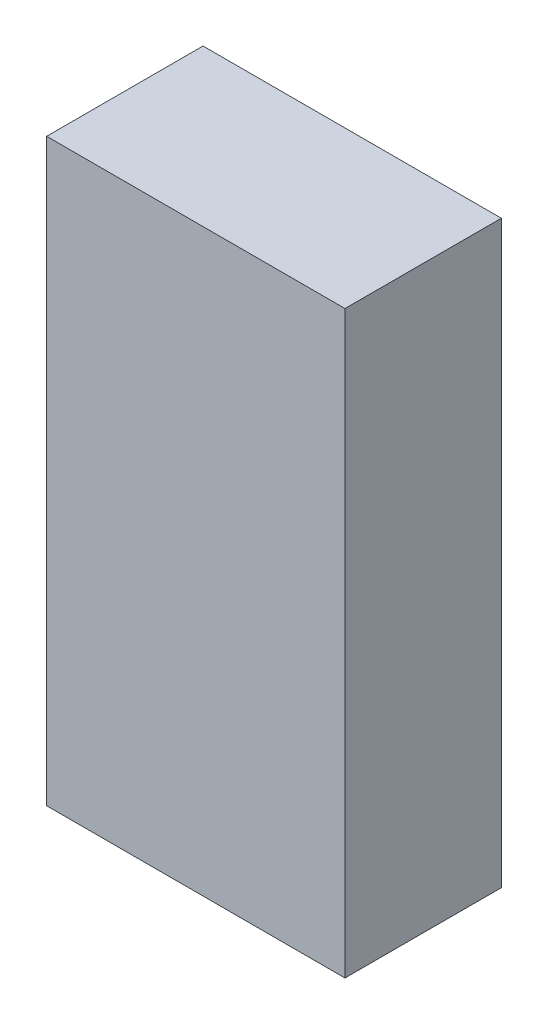
ISO-10303-21;
HEADER;
FILE_DESCRIPTION(('STEP AP214'),'2;1');
FILE_NAME('part.step','',(''),(''),'','','');
FILE_SCHEMA(('AUTOMOTIVE_DESIGN { 1 0 10303 214 1 1 1 1 }'));
ENDSEC;
DATA;
#1=APPLICATION_CONTEXT('core data for automotive mechanical design processes');
#2=APPLICATION_PROTOCOL_DEFINITION('international standard','automotive_design',2000,#1);
#3=PRODUCT_CONTEXT('',#1,'mechanical');
#4=PRODUCT('Part','Part','',(#3));
#5=PRODUCT_RELATED_PRODUCT_CATEGORY('part','',(#4));
#6=PRODUCT_DEFINITION_FORMATION('','',#4);
#7=PRODUCT_DEFINITION_CONTEXT('part definition',#1,'design');
#8=PRODUCT_DEFINITION('design','',#6,#7);
#9=PRODUCT_DEFINITION_SHAPE('','',#8);
#10=(LENGTH_UNIT() NAMED_UNIT(*) SI_UNIT(.MILLI.,.METRE.));
#11=(NAMED_UNIT(*) PLANE_ANGLE_UNIT() SI_UNIT($,.RADIAN.));
#12=(NAMED_UNIT(*) SI_UNIT($,.STERADIAN.) SOLID_ANGLE_UNIT());
#13=UNCERTAINTY_MEASURE_WITH_UNIT(LENGTH_MEASURE(1.E-05),#10,'distance_accuracy_value','');
#14=(GEOMETRIC_REPRESENTATION_CONTEXT(3) GLOBAL_UNCERTAINTY_ASSIGNED_CONTEXT((#13)) GLOBAL_UNIT_ASSIGNED_CONTEXT((#10,
#11,#12)) REPRESENTATION_CONTEXT('',''));
#15=CARTESIAN_POINT('',(0.,0.,0.));
#16=DIRECTION('',(0.,0.,1.));
#17=DIRECTION('',(1.,0.,0.));
#18=AXIS2_PLACEMENT_3D('',#15,#16,#17);
#19=CARTESIAN_POINT('',(62.,120.5,65.));
#20=DIRECTION('',(-1.,0.,0.));
#21=DIRECTION('',(0.,-1.,0.));
#22=AXIS2_PLACEMENT_3D('',#19,#20,#21);
#23=PLANE('',#22);
#24=DIRECTION('',(0.,1.,0.));
#25=VECTOR('',#24,1.);
#26=CARTESIAN_POINT('',(62.,120.5,0.));
#27=LINE('',#26,#25);
#28=CARTESIAN_POINT('',(62.,-120.5,0.));
#29=VERTEX_POINT('',#28);
#30=CARTESIAN_POINT('',(62.,120.5,0.));
#31=VERTEX_POINT('',#30);
#32=EDGE_CURVE('E96',#29,#31,#27,.T.);
#33=ORIENTED_EDGE('',*,*,#32,.T.);
#34=DIRECTION('',(0.,0.,-1.));
#35=VECTOR('',#34,1.);
#36=CARTESIAN_POINT('',(62.,120.5,65.));
#37=LINE('',#36,#35);
#38=CARTESIAN_POINT('',(62.,120.5,65.));
#39=VERTEX_POINT('',#38);
#40=EDGE_CURVE('E11',#39,#31,#37,.T.);
#41=ORIENTED_EDGE('',*,*,#40,.F.);
#42=DIRECTION('',(0.,1.,0.));
#43=VECTOR('',#42,1.);
#44=CARTESIAN_POINT('',(62.,120.5,65.));
#45=LINE('',#44,#43);
#46=CARTESIAN_POINT('',(62.,-120.5,65.));
#47=VERTEX_POINT('',#46);
#48=EDGE_CURVE('E84',#47,#39,#45,.T.);
#49=ORIENTED_EDGE('',*,*,#48,.F.);
#50=DIRECTION('',(0.,0.,-1.));
#51=VECTOR('',#50,1.);
#52=CARTESIAN_POINT('',(62.,-120.5,65.));
#53=LINE('',#52,#51);
#54=EDGE_CURVE('E92',#47,#29,#53,.T.);
#55=ORIENTED_EDGE('',*,*,#54,.T.);
#56=EDGE_LOOP('',(#33,#41,#49,#55));
#57=FACE_BOUND('',#56,.T.);
#58=ADVANCED_FACE('F33',(#57),#23,.F.);
#59=CARTESIAN_POINT('',(-62.,120.5,65.));
#60=DIRECTION('',(0.,-1.,0.));
#61=DIRECTION('',(0.,0.,-1.));
#62=AXIS2_PLACEMENT_3D('',#59,#60,#61);
#63=PLANE('',#62);
#64=DIRECTION('',(-1.,0.,0.));
#65=VECTOR('',#64,1.);
#66=CARTESIAN_POINT('',(-62.,120.5,0.));
#67=LINE('',#66,#65);
#68=CARTESIAN_POINT('',(-62.,120.5,0.));
#69=VERTEX_POINT('',#68);
#70=EDGE_CURVE('E88',#31,#69,#67,.T.);
#71=ORIENTED_EDGE('',*,*,#70,.T.);
#72=DIRECTION('',(0.,0.,-1.));
#73=VECTOR('',#72,1.);
#74=CARTESIAN_POINT('',(-62.,120.5,65.));
#75=LINE('',#74,#73);
#76=CARTESIAN_POINT('',(-62.,120.5,65.));
#77=VERTEX_POINT('',#76);
#78=EDGE_CURVE('E41',#77,#69,#75,.T.);
#79=ORIENTED_EDGE('',*,*,#78,.F.);
#80=DIRECTION('',(-1.,0.,0.));
#81=VECTOR('',#80,1.);
#82=CARTESIAN_POINT('',(-62.,120.5,65.));
#83=LINE('',#82,#81);
#84=EDGE_CURVE('E79',#39,#77,#83,.T.);
#85=ORIENTED_EDGE('',*,*,#84,.F.);
#86=ORIENTED_EDGE('',*,*,#40,.T.);
#87=EDGE_LOOP('',(#71,#79,#85,#86));
#88=FACE_BOUND('',#87,.T.);
#89=ADVANCED_FACE('F87',(#88),#63,.F.);
#90=CARTESIAN_POINT('',(-62.,120.5,65.));
#91=DIRECTION('',(1.,0.,0.));
#92=DIRECTION('',(0.,1.,0.));
#93=AXIS2_PLACEMENT_3D('',#90,#91,#92);
#94=PLANE('',#93);
#95=DIRECTION('',(0.,-1.,0.));
#96=VECTOR('',#95,1.);
#97=CARTESIAN_POINT('',(-62.,120.5,0.));
#98=LINE('',#97,#96);
#99=CARTESIAN_POINT('',(-62.,-120.5,0.));
#100=VERTEX_POINT('',#99);
#101=EDGE_CURVE('E66',#69,#100,#98,.T.);
#102=ORIENTED_EDGE('',*,*,#101,.T.);
#103=DIRECTION('',(0.,0.,-1.));
#104=VECTOR('',#103,1.);
#105=CARTESIAN_POINT('',(-62.,-120.5,65.));
#106=LINE('',#105,#104);
#107=CARTESIAN_POINT('',(-62.,-120.5,65.));
#108=VERTEX_POINT('',#107);
#109=EDGE_CURVE('E89',#108,#100,#106,.T.);
#110=ORIENTED_EDGE('',*,*,#109,.F.);
#111=DIRECTION('',(0.,-1.,0.));
#112=VECTOR('',#111,1.);
#113=CARTESIAN_POINT('',(-62.,120.5,65.));
#114=LINE('',#113,#112);
#115=EDGE_CURVE('E82',#77,#108,#114,.T.);
#116=ORIENTED_EDGE('',*,*,#115,.F.);
#117=ORIENTED_EDGE('',*,*,#78,.T.);
#118=EDGE_LOOP('',(#102,#110,#116,#117));
#119=FACE_BOUND('',#118,.T.);
#120=ADVANCED_FACE('F90',(#119),#94,.F.);
#121=CARTESIAN_POINT('',(-62.,-120.5,65.));
#122=DIRECTION('',(0.,1.,0.));
#123=DIRECTION('',(0.,0.,1.));
#124=AXIS2_PLACEMENT_3D('',#121,#122,#123);
#125=PLANE('',#124);
#126=DIRECTION('',(1.,0.,0.));
#127=VECTOR('',#126,1.);
#128=CARTESIAN_POINT('',(-62.,-120.5,0.));
#129=LINE('',#128,#127);
#130=EDGE_CURVE('E72',#100,#29,#129,.T.);
#131=ORIENTED_EDGE('',*,*,#130,.T.);
#132=ORIENTED_EDGE('',*,*,#54,.F.);
#133=DIRECTION('',(1.,0.,0.));
#134=VECTOR('',#133,1.);
#135=CARTESIAN_POINT('',(-62.,-120.5,65.));
#136=LINE('',#135,#134);
#137=EDGE_CURVE('E49',#108,#47,#136,.T.);
#138=ORIENTED_EDGE('',*,*,#137,.F.);
#139=ORIENTED_EDGE('',*,*,#109,.T.);
#140=EDGE_LOOP('',(#131,#132,#138,#139));
#141=FACE_BOUND('',#140,.T.);
#142=ADVANCED_FACE('F103',(#141),#125,.F.);
#143=CARTESIAN_POINT('',(0.,0.,65.));
#144=DIRECTION('',(0.,0.,1.));
#145=DIRECTION('',(1.,0.,0.));
#146=AXIS2_PLACEMENT_3D('',#143,#144,#145);
#147=PLANE('',#146);
#148=ORIENTED_EDGE('',*,*,#48,.T.);
#149=ORIENTED_EDGE('',*,*,#84,.T.);
#150=ORIENTED_EDGE('',*,*,#115,.T.);
#151=ORIENTED_EDGE('',*,*,#137,.T.);
#152=EDGE_LOOP('',(#148,#149,#150,#151));
#153=FACE_BOUND('',#152,.T.);
#154=ADVANCED_FACE('F80',(#153),#147,.T.);
#155=CARTESIAN_POINT('',(0.,0.,0.));
#156=DIRECTION('',(0.,0.,1.));
#157=DIRECTION('',(1.,0.,0.));
#158=AXIS2_PLACEMENT_3D('',#155,#156,#157);
#159=PLANE('',#158);
#160=ORIENTED_EDGE('',*,*,#32,.F.);
#161=ORIENTED_EDGE('',*,*,#130,.F.);
#162=ORIENTED_EDGE('',*,*,#101,.F.);
#163=ORIENTED_EDGE('',*,*,#70,.F.);
#164=EDGE_LOOP('',(#160,#161,#162,#163));
#165=FACE_BOUND('',#164,.T.);
#166=ADVANCED_FACE('F106',(#165),#159,.F.);
#167=CLOSED_SHELL('',(#58,#89,#120,#142,#154,#166));
#168=MANIFOLD_SOLID_BREP('B2',#167);
#169=ADVANCED_BREP_SHAPE_REPRESENTATION('',(#18,#168),#14);
#170=SHAPE_DEFINITION_REPRESENTATION(#9,#169);
ENDSEC;
END-ISO-10303-21;
